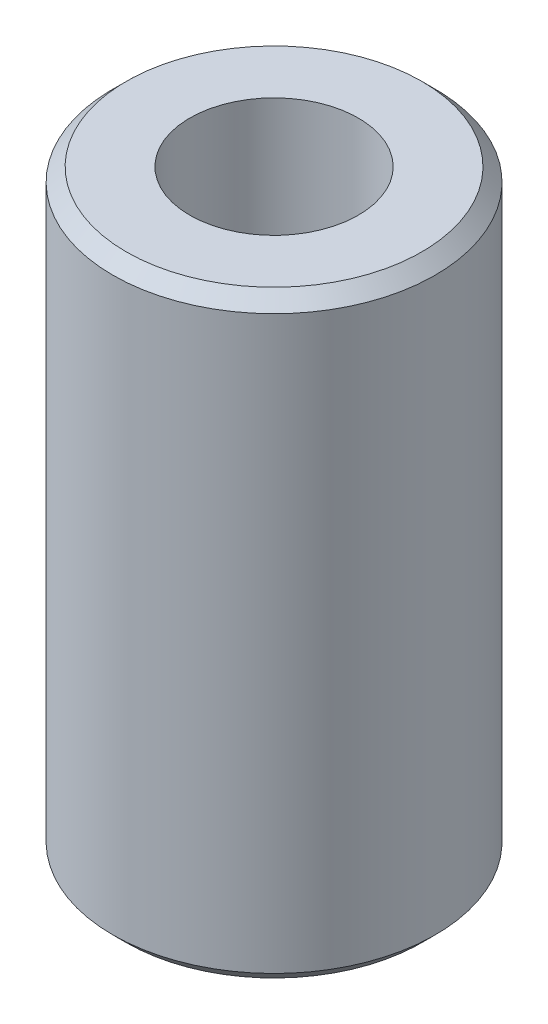
ISO-10303-21;
HEADER;
FILE_DESCRIPTION(('STEP AP214'),'2;1');
FILE_NAME('part.step','',(''),(''),'','','');
FILE_SCHEMA(('AUTOMOTIVE_DESIGN { 1 0 10303 214 1 1 1 1 }'));
ENDSEC;
DATA;
#1=APPLICATION_CONTEXT('core data for automotive mechanical design processes');
#2=APPLICATION_PROTOCOL_DEFINITION('international standard','automotive_design',2000,#1);
#3=PRODUCT_CONTEXT('',#1,'mechanical');
#4=PRODUCT('Part','Part','',(#3));
#5=PRODUCT_RELATED_PRODUCT_CATEGORY('part','',(#4));
#6=PRODUCT_DEFINITION_FORMATION('','',#4);
#7=PRODUCT_DEFINITION_CONTEXT('part definition',#1,'design');
#8=PRODUCT_DEFINITION('design','',#6,#7);
#9=PRODUCT_DEFINITION_SHAPE('','',#8);
#10=(LENGTH_UNIT() NAMED_UNIT(*) SI_UNIT(.MILLI.,.METRE.));
#11=(NAMED_UNIT(*) PLANE_ANGLE_UNIT() SI_UNIT($,.RADIAN.));
#12=(NAMED_UNIT(*) SI_UNIT($,.STERADIAN.) SOLID_ANGLE_UNIT());
#13=UNCERTAINTY_MEASURE_WITH_UNIT(LENGTH_MEASURE(1.E-05),#10,'distance_accuracy_value','');
#14=(GEOMETRIC_REPRESENTATION_CONTEXT(3) GLOBAL_UNCERTAINTY_ASSIGNED_CONTEXT((#13)) GLOBAL_UNIT_ASSIGNED_CONTEXT((#10,
#11,#12)) REPRESENTATION_CONTEXT('',''));
#15=CARTESIAN_POINT('',(0.,0.,0.));
#16=DIRECTION('',(0.,0.,1.));
#17=DIRECTION('',(1.,0.,0.));
#18=AXIS2_PLACEMENT_3D('',#15,#16,#17);
#19=CARTESIAN_POINT('',(0.,8.837499978,0.));
#20=DIRECTION('',(0.,-1.,0.));
#21=DIRECTION('',(0.,0.,-1.));
#22=AXIS2_PLACEMENT_3D('',#19,#20,#21);
#23=CYLINDRICAL_SURFACE('',#22,4.7625);
#24=CARTESIAN_POINT('',(0.,-8.44062497800001,0.));
#25=DIRECTION('',(0.,1.,0.));
#26=DIRECTION('',(0.,0.,1.));
#27=AXIS2_PLACEMENT_3D('',#24,#25,#26);
#28=CIRCLE('',#27,4.7625);
#29=CARTESIAN_POINT('',(0.,-8.44062497800001,4.7625));
#30=VERTEX_POINT('',#29);
#31=EDGE_CURVE('E45',#30,#30,#28,.T.);
#32=ORIENTED_EDGE('',*,*,#31,.T.);
#33=EDGE_LOOP('',(#32));
#34=FACE_BOUND('',#33,.T.);
#35=CARTESIAN_POINT('',(0.,8.440624978,0.));
#36=DIRECTION('',(0.,1.,0.));
#37=DIRECTION('',(0.,0.,1.));
#38=AXIS2_PLACEMENT_3D('',#35,#36,#37);
#39=CIRCLE('',#38,4.7625);
#40=CARTESIAN_POINT('',(0.,8.440624978,4.7625));
#41=VERTEX_POINT('',#40);
#42=EDGE_CURVE('E49',#41,#41,#39,.F.);
#43=ORIENTED_EDGE('',*,*,#42,.T.);
#44=EDGE_LOOP('',(#43));
#45=FACE_BOUND('',#44,.T.);
#46=ADVANCED_FACE('F33',(#34,#45),#23,.T.);
#47=CARTESIAN_POINT('',(0.,8.837499978,0.));
#48=DIRECTION('',(0.,1.,0.));
#49=DIRECTION('',(0.,0.,1.));
#50=AXIS2_PLACEMENT_3D('',#47,#48,#49);
#51=PLANE('',#50);
#52=CARTESIAN_POINT('',(0.,8.837499978,0.));
#53=DIRECTION('',(0.,1.,0.));
#54=DIRECTION('',(0.,0.,1.));
#55=AXIS2_PLACEMENT_3D('',#52,#53,#54);
#56=CIRCLE('',#55,2.4892);
#57=CARTESIAN_POINT('',(0.,8.837499978,2.4892));
#58=VERTEX_POINT('',#57);
#59=EDGE_CURVE('E57',#58,#58,#56,.T.);
#60=ORIENTED_EDGE('',*,*,#59,.F.);
#61=EDGE_LOOP('',(#60));
#62=FACE_BOUND('',#61,.T.);
#63=CARTESIAN_POINT('',(0.,8.837499978,0.));
#64=DIRECTION('',(0.,1.,0.));
#65=DIRECTION('',(0.,0.,1.));
#66=AXIS2_PLACEMENT_3D('',#63,#64,#65);
#67=CIRCLE('',#66,4.365625);
#68=CARTESIAN_POINT('',(0.,8.837499978,4.365625));
#69=VERTEX_POINT('',#68);
#70=EDGE_CURVE('E10',#69,#69,#67,.T.);
#71=ORIENTED_EDGE('',*,*,#70,.T.);
#72=EDGE_LOOP('',(#71));
#73=FACE_BOUND('',#72,.T.);
#74=ADVANCED_FACE('F63',(#62,#73),#51,.T.);
#75=CARTESIAN_POINT('',(0.,-8.837499978,0.));
#76=DIRECTION('',(0.,1.,0.));
#77=DIRECTION('',(0.,0.,1.));
#78=AXIS2_PLACEMENT_3D('',#75,#76,#77);
#79=PLANE('',#78);
#80=CARTESIAN_POINT('',(0.,-8.837499978,0.));
#81=DIRECTION('',(0.,1.,0.));
#82=DIRECTION('',(0.,0.,1.));
#83=AXIS2_PLACEMENT_3D('',#80,#81,#82);
#84=CIRCLE('',#83,2.4892);
#85=CARTESIAN_POINT('',(0.,-8.837499978,2.4892));
#86=VERTEX_POINT('',#85);
#87=EDGE_CURVE('E54',#86,#86,#84,.T.);
#88=ORIENTED_EDGE('',*,*,#87,.T.);
#89=EDGE_LOOP('',(#88));
#90=FACE_BOUND('',#89,.T.);
#91=CARTESIAN_POINT('',(0.,-8.837499978,0.));
#92=DIRECTION('',(0.,1.,0.));
#93=DIRECTION('',(0.,0.,1.));
#94=AXIS2_PLACEMENT_3D('',#91,#92,#93);
#95=CIRCLE('',#94,4.36562500000001);
#96=CARTESIAN_POINT('',(0.,-8.837499978,4.36562500000001));
#97=VERTEX_POINT('',#96);
#98=EDGE_CURVE('E41',#97,#97,#95,.F.);
#99=ORIENTED_EDGE('',*,*,#98,.T.);
#100=EDGE_LOOP('',(#99));
#101=FACE_BOUND('',#100,.T.);
#102=ADVANCED_FACE('F65',(#90,#101),#79,.F.);
#103=CARTESIAN_POINT('',(0.,-8.44062497800001,0.));
#104=DIRECTION('',(0.,1.,0.));
#105=DIRECTION('',(0.,0.,1.));
#106=AXIS2_PLACEMENT_3D('',#103,#104,#105);
#107=CONICAL_SURFACE('',#106,4.7625,0.785398163397452);
#108=ORIENTED_EDGE('',*,*,#98,.F.);
#109=EDGE_LOOP('',(#108));
#110=FACE_BOUND('',#109,.T.);
#111=ORIENTED_EDGE('',*,*,#31,.F.);
#112=EDGE_LOOP('',(#111));
#113=FACE_BOUND('',#112,.T.);
#114=ADVANCED_FACE('F71',(#110,#113),#107,.T.);
#115=CARTESIAN_POINT('',(0.,8.837499978,0.));
#116=DIRECTION('',(0.,-1.,0.));
#117=DIRECTION('',(0.,0.,-1.));
#118=AXIS2_PLACEMENT_3D('',#115,#116,#117);
#119=CONICAL_SURFACE('',#118,4.365625,0.785398163397441);
#120=ORIENTED_EDGE('',*,*,#42,.F.);
#121=EDGE_LOOP('',(#120));
#122=FACE_BOUND('',#121,.T.);
#123=ORIENTED_EDGE('',*,*,#70,.F.);
#124=EDGE_LOOP('',(#123));
#125=FACE_BOUND('',#124,.T.);
#126=ADVANCED_FACE('F36',(#122,#125),#119,.T.);
#127=CARTESIAN_POINT('',(0.,-8.837499978,0.));
#128=DIRECTION('',(0.,1.,0.));
#129=DIRECTION('',(0.,0.,1.));
#130=AXIS2_PLACEMENT_3D('',#127,#128,#129);
#131=CYLINDRICAL_SURFACE('',#130,2.4892);
#132=ORIENTED_EDGE('',*,*,#87,.F.);
#133=EDGE_LOOP('',(#132));
#134=FACE_BOUND('',#133,.T.);
#135=ORIENTED_EDGE('',*,*,#59,.T.);
#136=EDGE_LOOP('',(#135));
#137=FACE_BOUND('',#136,.T.);
#138=ADVANCED_FACE('F61',(#134,#137),#131,.F.);
#139=CLOSED_SHELL('',(#46,#74,#102,#114,#126,#138));
#140=MANIFOLD_SOLID_BREP('B2',#139);
#141=ADVANCED_BREP_SHAPE_REPRESENTATION('',(#18,#140),#14);
#142=SHAPE_DEFINITION_REPRESENTATION(#9,#141);
ENDSEC;
END-ISO-10303-21;
